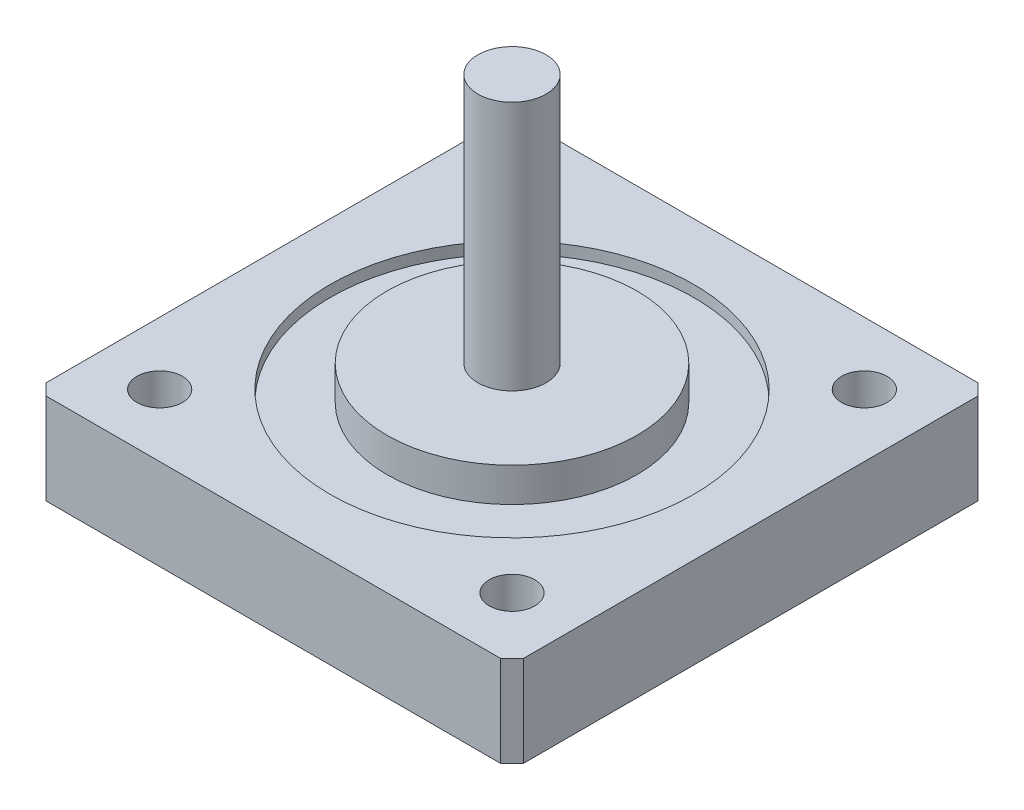
ISO-10303-21;
HEADER;
FILE_DESCRIPTION(('STEP AP214'),'2;1');
FILE_NAME('part.step','',(''),(''),'','','');
FILE_SCHEMA(('AUTOMOTIVE_DESIGN { 1 0 10303 214 1 1 1 1 }'));
ENDSEC;
DATA;
#1=APPLICATION_CONTEXT('core data for automotive mechanical design processes');
#2=APPLICATION_PROTOCOL_DEFINITION('international standard','automotive_design',2000,#1);
#3=PRODUCT_CONTEXT('',#1,'mechanical');
#4=PRODUCT('Part','Part','',(#3));
#5=PRODUCT_RELATED_PRODUCT_CATEGORY('part','',(#4));
#6=PRODUCT_DEFINITION_FORMATION('','',#4);
#7=PRODUCT_DEFINITION_CONTEXT('part definition',#1,'design');
#8=PRODUCT_DEFINITION('design','',#6,#7);
#9=PRODUCT_DEFINITION_SHAPE('','',#8);
#10=(LENGTH_UNIT() NAMED_UNIT(*) SI_UNIT(.MILLI.,.METRE.));
#11=(NAMED_UNIT(*) PLANE_ANGLE_UNIT() SI_UNIT($,.RADIAN.));
#12=(NAMED_UNIT(*) SI_UNIT($,.STERADIAN.) SOLID_ANGLE_UNIT());
#13=UNCERTAINTY_MEASURE_WITH_UNIT(LENGTH_MEASURE(1.E-05),#10,'distance_accuracy_value','');
#14=(GEOMETRIC_REPRESENTATION_CONTEXT(3) GLOBAL_UNCERTAINTY_ASSIGNED_CONTEXT((#13)) GLOBAL_UNIT_ASSIGNED_CONTEXT((#10,
#11,#12)) REPRESENTATION_CONTEXT('',''));
#15=CARTESIAN_POINT('',(0.,0.,0.));
#16=DIRECTION('',(0.,0.,1.));
#17=DIRECTION('',(1.,0.,0.));
#18=AXIS2_PLACEMENT_3D('',#15,#16,#17);
#19=CARTESIAN_POINT('',(-20.,8.,-21.));
#20=DIRECTION('',(0.,0.,1.));
#21=DIRECTION('',(1.,0.,0.));
#22=AXIS2_PLACEMENT_3D('',#19,#20,#21);
#23=PLANE('',#22);
#24=DIRECTION('',(-1.,0.,0.));
#25=VECTOR('',#24,1.);
#26=CARTESIAN_POINT('',(-20.,0.,-21.));
#27=LINE('',#26,#25);
#28=CARTESIAN_POINT('',(20.,0.,-21.));
#29=VERTEX_POINT('',#28);
#30=CARTESIAN_POINT('',(-20.,0.,-21.));
#31=VERTEX_POINT('',#30);
#32=EDGE_CURVE('E131',#29,#31,#27,.T.);
#33=ORIENTED_EDGE('',*,*,#32,.T.);
#34=DIRECTION('',(0.,-1.,0.));
#35=VECTOR('',#34,1.);
#36=CARTESIAN_POINT('',(-20.,8.,-21.));
#37=LINE('',#36,#35);
#38=CARTESIAN_POINT('',(-20.,8.,-21.));
#39=VERTEX_POINT('',#38);
#40=EDGE_CURVE('E11',#39,#31,#37,.T.);
#41=ORIENTED_EDGE('',*,*,#40,.F.);
#42=DIRECTION('',(-1.,0.,0.));
#43=VECTOR('',#42,1.);
#44=CARTESIAN_POINT('',(-20.,8.,-21.));
#45=LINE('',#44,#43);
#46=CARTESIAN_POINT('',(20.,8.,-21.));
#47=VERTEX_POINT('',#46);
#48=EDGE_CURVE('E146',#47,#39,#45,.T.);
#49=ORIENTED_EDGE('',*,*,#48,.F.);
#50=DIRECTION('',(0.,-1.,0.));
#51=VECTOR('',#50,1.);
#52=CARTESIAN_POINT('',(20.,8.,-21.));
#53=LINE('',#52,#51);
#54=EDGE_CURVE('E127',#47,#29,#53,.T.);
#55=ORIENTED_EDGE('',*,*,#54,.T.);
#56=EDGE_LOOP('',(#33,#41,#49,#55));
#57=FACE_BOUND('',#56,.T.);
#58=ADVANCED_FACE('F34',(#57),#23,.F.);
#59=CARTESIAN_POINT('',(-21.,8.,-20.));
#60=DIRECTION('',(0.707106781186549,0.,0.707106781186546));
#61=DIRECTION('',(0.707106781186546,0.,-0.707106781186549));
#62=AXIS2_PLACEMENT_3D('',#59,#60,#61);
#63=PLANE('',#62);
#64=DIRECTION('',(-0.707106781186546,0.,0.707106781186549));
#65=VECTOR('',#64,1.);
#66=CARTESIAN_POINT('',(-21.,0.,-20.));
#67=LINE('',#66,#65);
#68=CARTESIAN_POINT('',(-21.,0.,-20.));
#69=VERTEX_POINT('',#68);
#70=EDGE_CURVE('E134',#31,#69,#67,.T.);
#71=ORIENTED_EDGE('',*,*,#70,.T.);
#72=DIRECTION('',(0.,-1.,0.));
#73=VECTOR('',#72,1.);
#74=CARTESIAN_POINT('',(-21.,8.,-20.));
#75=LINE('',#74,#73);
#76=CARTESIAN_POINT('',(-21.,8.,-20.));
#77=VERTEX_POINT('',#76);
#78=EDGE_CURVE('E43',#77,#69,#75,.T.);
#79=ORIENTED_EDGE('',*,*,#78,.F.);
#80=DIRECTION('',(-0.707106781186546,0.,0.707106781186549));
#81=VECTOR('',#80,1.);
#82=CARTESIAN_POINT('',(-21.,8.,-20.));
#83=LINE('',#82,#81);
#84=EDGE_CURVE('E94',#39,#77,#83,.T.);
#85=ORIENTED_EDGE('',*,*,#84,.F.);
#86=ORIENTED_EDGE('',*,*,#40,.T.);
#87=EDGE_LOOP('',(#71,#79,#85,#86));
#88=FACE_BOUND('',#87,.T.);
#89=ADVANCED_FACE('F238',(#88),#63,.F.);
#90=CARTESIAN_POINT('',(-21.,8.,-20.));
#91=DIRECTION('',(1.,0.,0.));
#92=DIRECTION('',(0.,0.,-1.));
#93=AXIS2_PLACEMENT_3D('',#90,#91,#92);
#94=PLANE('',#93);
#95=DIRECTION('',(0.,0.,1.));
#96=VECTOR('',#95,1.);
#97=CARTESIAN_POINT('',(-21.,0.,-20.));
#98=LINE('',#97,#96);
#99=CARTESIAN_POINT('',(-21.,0.,20.));
#100=VERTEX_POINT('',#99);
#101=EDGE_CURVE('E137',#69,#100,#98,.T.);
#102=ORIENTED_EDGE('',*,*,#101,.T.);
#103=DIRECTION('',(0.,-1.,0.));
#104=VECTOR('',#103,1.);
#105=CARTESIAN_POINT('',(-21.,8.,20.));
#106=LINE('',#105,#104);
#107=CARTESIAN_POINT('',(-21.,8.,20.));
#108=VERTEX_POINT('',#107);
#109=EDGE_CURVE('E153',#108,#100,#106,.T.);
#110=ORIENTED_EDGE('',*,*,#109,.F.);
#111=DIRECTION('',(0.,0.,1.));
#112=VECTOR('',#111,1.);
#113=CARTESIAN_POINT('',(-21.,8.,-20.));
#114=LINE('',#113,#112);
#115=EDGE_CURVE('E162',#77,#108,#114,.T.);
#116=ORIENTED_EDGE('',*,*,#115,.F.);
#117=ORIENTED_EDGE('',*,*,#78,.T.);
#118=EDGE_LOOP('',(#102,#110,#116,#117));
#119=FACE_BOUND('',#118,.T.);
#120=ADVANCED_FACE('F160',(#119),#94,.F.);
#121=CARTESIAN_POINT('',(-21.,8.,20.));
#122=DIRECTION('',(0.707106781186549,0.,-0.707106781186546));
#123=DIRECTION('',(-0.707106781186546,0.,-0.707106781186549));
#124=AXIS2_PLACEMENT_3D('',#121,#122,#123);
#125=PLANE('',#124);
#126=DIRECTION('',(0.707106781186546,0.,0.707106781186549));
#127=VECTOR('',#126,1.);
#128=CARTESIAN_POINT('',(-21.,0.,20.));
#129=LINE('',#128,#127);
#130=CARTESIAN_POINT('',(-20.,0.,21.));
#131=VERTEX_POINT('',#130);
#132=EDGE_CURVE('E139',#100,#131,#129,.T.);
#133=ORIENTED_EDGE('',*,*,#132,.T.);
#134=DIRECTION('',(0.,-1.,0.));
#135=VECTOR('',#134,1.);
#136=CARTESIAN_POINT('',(-20.,8.,21.));
#137=LINE('',#136,#135);
#138=CARTESIAN_POINT('',(-20.,8.,21.));
#139=VERTEX_POINT('',#138);
#140=EDGE_CURVE('E150',#139,#131,#137,.T.);
#141=ORIENTED_EDGE('',*,*,#140,.F.);
#142=DIRECTION('',(0.707106781186546,0.,0.707106781186549));
#143=VECTOR('',#142,1.);
#144=CARTESIAN_POINT('',(-21.,8.,20.));
#145=LINE('',#144,#143);
#146=EDGE_CURVE('E174',#108,#139,#145,.T.);
#147=ORIENTED_EDGE('',*,*,#146,.F.);
#148=ORIENTED_EDGE('',*,*,#109,.T.);
#149=EDGE_LOOP('',(#133,#141,#147,#148));
#150=FACE_BOUND('',#149,.T.);
#151=ADVANCED_FACE('F170',(#150),#125,.F.);
#152=CARTESIAN_POINT('',(-20.,8.,21.));
#153=DIRECTION('',(0.,0.,-1.));
#154=DIRECTION('',(-1.,0.,0.));
#155=AXIS2_PLACEMENT_3D('',#152,#153,#154);
#156=PLANE('',#155);
#157=DIRECTION('',(1.,0.,0.));
#158=VECTOR('',#157,1.);
#159=CARTESIAN_POINT('',(-20.,0.,21.));
#160=LINE('',#159,#158);
#161=CARTESIAN_POINT('',(20.,0.,21.));
#162=VERTEX_POINT('',#161);
#163=EDGE_CURVE('E141',#131,#162,#160,.T.);
#164=ORIENTED_EDGE('',*,*,#163,.T.);
#165=DIRECTION('',(0.,-1.,0.));
#166=VECTOR('',#165,1.);
#167=CARTESIAN_POINT('',(20.,8.,21.));
#168=LINE('',#167,#166);
#169=CARTESIAN_POINT('',(20.,8.,21.));
#170=VERTEX_POINT('',#169);
#171=EDGE_CURVE('E122',#170,#162,#168,.T.);
#172=ORIENTED_EDGE('',*,*,#171,.F.);
#173=DIRECTION('',(1.,0.,0.));
#174=VECTOR('',#173,1.);
#175=CARTESIAN_POINT('',(-20.,8.,21.));
#176=LINE('',#175,#174);
#177=EDGE_CURVE('E113',#139,#170,#176,.T.);
#178=ORIENTED_EDGE('',*,*,#177,.F.);
#179=ORIENTED_EDGE('',*,*,#140,.T.);
#180=EDGE_LOOP('',(#164,#172,#178,#179));
#181=FACE_BOUND('',#180,.T.);
#182=ADVANCED_FACE('F173',(#181),#156,.F.);
#183=CARTESIAN_POINT('',(20.,8.,21.));
#184=DIRECTION('',(-0.707106781186549,0.,-0.707106781186546));
#185=DIRECTION('',(-0.707106781186546,0.,0.707106781186549));
#186=AXIS2_PLACEMENT_3D('',#183,#184,#185);
#187=PLANE('',#186);
#188=DIRECTION('',(0.707106781186546,0.,-0.707106781186549));
#189=VECTOR('',#188,1.);
#190=CARTESIAN_POINT('',(20.,0.,21.));
#191=LINE('',#190,#189);
#192=CARTESIAN_POINT('',(21.,0.,20.));
#193=VERTEX_POINT('',#192);
#194=EDGE_CURVE('E121',#162,#193,#191,.T.);
#195=ORIENTED_EDGE('',*,*,#194,.T.);
#196=DIRECTION('',(0.,-1.,0.));
#197=VECTOR('',#196,1.);
#198=CARTESIAN_POINT('',(21.,8.,20.));
#199=LINE('',#198,#197);
#200=CARTESIAN_POINT('',(21.,8.,20.));
#201=VERTEX_POINT('',#200);
#202=EDGE_CURVE('E118',#201,#193,#199,.T.);
#203=ORIENTED_EDGE('',*,*,#202,.F.);
#204=DIRECTION('',(0.707106781186546,0.,-0.707106781186549));
#205=VECTOR('',#204,1.);
#206=CARTESIAN_POINT('',(20.,8.,21.));
#207=LINE('',#206,#205);
#208=EDGE_CURVE('E107',#170,#201,#207,.T.);
#209=ORIENTED_EDGE('',*,*,#208,.F.);
#210=ORIENTED_EDGE('',*,*,#171,.T.);
#211=EDGE_LOOP('',(#195,#203,#209,#210));
#212=FACE_BOUND('',#211,.T.);
#213=ADVANCED_FACE('F119',(#212),#187,.F.);
#214=CARTESIAN_POINT('',(21.,8.,-20.));
#215=DIRECTION('',(-1.,0.,0.));
#216=DIRECTION('',(0.,0.,1.));
#217=AXIS2_PLACEMENT_3D('',#214,#215,#216);
#218=PLANE('',#217);
#219=DIRECTION('',(0.,0.,-1.));
#220=VECTOR('',#219,1.);
#221=CARTESIAN_POINT('',(21.,0.,-20.));
#222=LINE('',#221,#220);
#223=CARTESIAN_POINT('',(21.,0.,-20.));
#224=VERTEX_POINT('',#223);
#225=EDGE_CURVE('E80',#193,#224,#222,.T.);
#226=ORIENTED_EDGE('',*,*,#225,.T.);
#227=DIRECTION('',(0.,-1.,0.));
#228=VECTOR('',#227,1.);
#229=CARTESIAN_POINT('',(21.,8.,-20.));
#230=LINE('',#229,#228);
#231=CARTESIAN_POINT('',(21.,8.,-20.));
#232=VERTEX_POINT('',#231);
#233=EDGE_CURVE('E123',#232,#224,#230,.T.);
#234=ORIENTED_EDGE('',*,*,#233,.F.);
#235=DIRECTION('',(0.,0.,-1.));
#236=VECTOR('',#235,1.);
#237=CARTESIAN_POINT('',(21.,8.,-20.));
#238=LINE('',#237,#236);
#239=EDGE_CURVE('E111',#201,#232,#238,.T.);
#240=ORIENTED_EDGE('',*,*,#239,.F.);
#241=ORIENTED_EDGE('',*,*,#202,.T.);
#242=EDGE_LOOP('',(#226,#234,#240,#241));
#243=FACE_BOUND('',#242,.T.);
#244=ADVANCED_FACE('F125',(#243),#218,.F.);
#245=CARTESIAN_POINT('',(20.,8.,-21.));
#246=DIRECTION('',(-0.707106781186546,0.,0.707106781186549));
#247=DIRECTION('',(0.707106781186549,0.,0.707106781186546));
#248=AXIS2_PLACEMENT_3D('',#245,#246,#247);
#249=PLANE('',#248);
#250=DIRECTION('',(-0.707106781186549,0.,-0.707106781186546));
#251=VECTOR('',#250,1.);
#252=CARTESIAN_POINT('',(20.,0.,-21.));
#253=LINE('',#252,#251);
#254=EDGE_CURVE('E86',#224,#29,#253,.T.);
#255=ORIENTED_EDGE('',*,*,#254,.T.);
#256=ORIENTED_EDGE('',*,*,#54,.F.);
#257=DIRECTION('',(-0.707106781186549,0.,-0.707106781186546));
#258=VECTOR('',#257,1.);
#259=CARTESIAN_POINT('',(20.,8.,-21.));
#260=LINE('',#259,#258);
#261=EDGE_CURVE('E51',#232,#47,#260,.T.);
#262=ORIENTED_EDGE('',*,*,#261,.F.);
#263=ORIENTED_EDGE('',*,*,#233,.T.);
#264=EDGE_LOOP('',(#255,#256,#262,#263));
#265=FACE_BOUND('',#264,.T.);
#266=ADVANCED_FACE('F245',(#265),#249,.F.);
#267=CARTESIAN_POINT('',(0.,8.,0.));
#268=DIRECTION('',(0.,-1.,0.));
#269=DIRECTION('',(0.,0.,-1.));
#270=AXIS2_PLACEMENT_3D('',#267,#268,#269);
#271=PLANE('',#270);
#272=CARTESIAN_POINT('',(15.5,8.,-15.5));
#273=DIRECTION('',(0.,1.,0.));
#274=DIRECTION('',(0.,0.,1.));
#275=AXIS2_PLACEMENT_3D('',#272,#273,#274);
#276=CIRCLE('',#275,2.00000000000001);
#277=CARTESIAN_POINT('',(15.5,8.,-13.5));
#278=VERTEX_POINT('',#277);
#279=EDGE_CURVE('E207',#278,#278,#276,.T.);
#280=ORIENTED_EDGE('',*,*,#279,.F.);
#281=EDGE_LOOP('',(#280));
#282=FACE_BOUND('',#281,.T.);
#283=CARTESIAN_POINT('',(15.5,8.,15.5));
#284=DIRECTION('',(0.,1.,0.));
#285=DIRECTION('',(0.,0.,1.));
#286=AXIS2_PLACEMENT_3D('',#283,#284,#285);
#287=CIRCLE('',#286,2.);
#288=CARTESIAN_POINT('',(15.5,8.,17.5));
#289=VERTEX_POINT('',#288);
#290=EDGE_CURVE('E201',#289,#289,#287,.T.);
#291=ORIENTED_EDGE('',*,*,#290,.F.);
#292=EDGE_LOOP('',(#291));
#293=FACE_BOUND('',#292,.T.);
#294=CARTESIAN_POINT('',(-15.5,8.,15.5));
#295=DIRECTION('',(0.,1.,0.));
#296=DIRECTION('',(0.,0.,1.));
#297=AXIS2_PLACEMENT_3D('',#294,#295,#296);
#298=CIRCLE('',#297,2.);
#299=CARTESIAN_POINT('',(-15.5,8.,17.5));
#300=VERTEX_POINT('',#299);
#301=EDGE_CURVE('E195',#300,#300,#298,.T.);
#302=ORIENTED_EDGE('',*,*,#301,.F.);
#303=EDGE_LOOP('',(#302));
#304=FACE_BOUND('',#303,.T.);
#305=CARTESIAN_POINT('',(-15.5,8.,-15.5));
#306=DIRECTION('',(0.,1.,0.));
#307=DIRECTION('',(0.,0.,1.));
#308=AXIS2_PLACEMENT_3D('',#305,#306,#307);
#309=CIRCLE('',#308,2.);
#310=CARTESIAN_POINT('',(-15.5,8.,-13.5));
#311=VERTEX_POINT('',#310);
#312=EDGE_CURVE('E189',#311,#311,#309,.T.);
#313=ORIENTED_EDGE('',*,*,#312,.F.);
#314=EDGE_LOOP('',(#313));
#315=FACE_BOUND('',#314,.T.);
#316=CARTESIAN_POINT('',(0.,8.,0.));
#317=DIRECTION('',(0.,1.,0.));
#318=DIRECTION('',(0.,0.,1.));
#319=AXIS2_PLACEMENT_3D('',#316,#317,#318);
#320=CIRCLE('',#319,16.);
#321=CARTESIAN_POINT('',(0.,8.,16.));
#322=VERTEX_POINT('',#321);
#323=EDGE_CURVE('E180',#322,#322,#320,.T.);
#324=ORIENTED_EDGE('',*,*,#323,.F.);
#325=EDGE_LOOP('',(#324));
#326=FACE_BOUND('',#325,.T.);
#327=ORIENTED_EDGE('',*,*,#48,.T.);
#328=ORIENTED_EDGE('',*,*,#84,.T.);
#329=ORIENTED_EDGE('',*,*,#115,.T.);
#330=ORIENTED_EDGE('',*,*,#146,.T.);
#331=ORIENTED_EDGE('',*,*,#177,.T.);
#332=ORIENTED_EDGE('',*,*,#208,.T.);
#333=ORIENTED_EDGE('',*,*,#239,.T.);
#334=ORIENTED_EDGE('',*,*,#261,.T.);
#335=EDGE_LOOP('',(#327,#328,#329,#330,#331,#332,#333,#334));
#336=FACE_BOUND('',#335,.T.);
#337=ADVANCED_FACE('F109',(#282,#293,#304,#315,#326,#336),#271,.F.);
#338=CARTESIAN_POINT('',(0.,0.,0.));
#339=DIRECTION('',(0.,-1.,0.));
#340=DIRECTION('',(0.,0.,-1.));
#341=AXIS2_PLACEMENT_3D('',#338,#339,#340);
#342=PLANE('',#341);
#343=CARTESIAN_POINT('',(15.5,0.,-15.5));
#344=DIRECTION('',(0.,1.,0.));
#345=DIRECTION('',(0.,0.,1.));
#346=AXIS2_PLACEMENT_3D('',#343,#344,#345);
#347=CIRCLE('',#346,2.00000000000001);
#348=CARTESIAN_POINT('',(15.5,0.,-13.5));
#349=VERTEX_POINT('',#348);
#350=EDGE_CURVE('E192',#349,#349,#347,.T.);
#351=ORIENTED_EDGE('',*,*,#350,.T.);
#352=EDGE_LOOP('',(#351));
#353=FACE_BOUND('',#352,.T.);
#354=CARTESIAN_POINT('',(15.5,0.,15.5));
#355=DIRECTION('',(0.,1.,0.));
#356=DIRECTION('',(0.,0.,1.));
#357=AXIS2_PLACEMENT_3D('',#354,#355,#356);
#358=CIRCLE('',#357,2.);
#359=CARTESIAN_POINT('',(15.5,0.,17.5));
#360=VERTEX_POINT('',#359);
#361=EDGE_CURVE('E204',#360,#360,#358,.T.);
#362=ORIENTED_EDGE('',*,*,#361,.T.);
#363=EDGE_LOOP('',(#362));
#364=FACE_BOUND('',#363,.T.);
#365=CARTESIAN_POINT('',(-15.5,0.,15.5));
#366=DIRECTION('',(0.,1.,0.));
#367=DIRECTION('',(0.,0.,1.));
#368=AXIS2_PLACEMENT_3D('',#365,#366,#367);
#369=CIRCLE('',#368,2.);
#370=CARTESIAN_POINT('',(-15.5,0.,17.5));
#371=VERTEX_POINT('',#370);
#372=EDGE_CURVE('E198',#371,#371,#369,.T.);
#373=ORIENTED_EDGE('',*,*,#372,.T.);
#374=EDGE_LOOP('',(#373));
#375=FACE_BOUND('',#374,.T.);
#376=CARTESIAN_POINT('',(-15.5,0.,-15.5));
#377=DIRECTION('',(0.,1.,0.));
#378=DIRECTION('',(0.,0.,1.));
#379=AXIS2_PLACEMENT_3D('',#376,#377,#378);
#380=CIRCLE('',#379,2.);
#381=CARTESIAN_POINT('',(-15.5,0.,-13.5));
#382=VERTEX_POINT('',#381);
#383=EDGE_CURVE('E188',#382,#382,#380,.T.);
#384=ORIENTED_EDGE('',*,*,#383,.T.);
#385=EDGE_LOOP('',(#384));
#386=FACE_BOUND('',#385,.T.);
#387=ORIENTED_EDGE('',*,*,#32,.F.);
#388=ORIENTED_EDGE('',*,*,#254,.F.);
#389=ORIENTED_EDGE('',*,*,#225,.F.);
#390=ORIENTED_EDGE('',*,*,#194,.F.);
#391=ORIENTED_EDGE('',*,*,#163,.F.);
#392=ORIENTED_EDGE('',*,*,#132,.F.);
#393=ORIENTED_EDGE('',*,*,#101,.F.);
#394=ORIENTED_EDGE('',*,*,#70,.F.);
#395=EDGE_LOOP('',(#387,#388,#389,#390,#391,#392,#393,#394));
#396=FACE_BOUND('',#395,.T.);
#397=ADVANCED_FACE('F166',(#353,#364,#375,#386,#396),#342,.T.);
#398=CARTESIAN_POINT('',(0.,7.,0.));
#399=DIRECTION('',(0.,1.,0.));
#400=DIRECTION('',(0.,0.,1.));
#401=AXIS2_PLACEMENT_3D('',#398,#399,#400);
#402=CYLINDRICAL_SURFACE('',#401,16.);
#403=CARTESIAN_POINT('',(0.,7.,0.));
#404=DIRECTION('',(0.,1.,0.));
#405=DIRECTION('',(0.,0.,1.));
#406=AXIS2_PLACEMENT_3D('',#403,#404,#405);
#407=CIRCLE('',#406,16.);
#408=CARTESIAN_POINT('',(0.,7.,16.));
#409=VERTEX_POINT('',#408);
#410=EDGE_CURVE('E135',#409,#409,#407,.T.);
#411=ORIENTED_EDGE('',*,*,#410,.F.);
#412=EDGE_LOOP('',(#411));
#413=FACE_BOUND('',#412,.T.);
#414=ORIENTED_EDGE('',*,*,#323,.T.);
#415=EDGE_LOOP('',(#414));
#416=FACE_BOUND('',#415,.T.);
#417=ADVANCED_FACE('F294',(#413,#416),#402,.F.);
#418=CARTESIAN_POINT('',(0.,7.,0.));
#419=DIRECTION('',(0.,1.,0.));
#420=DIRECTION('',(0.,0.,1.));
#421=AXIS2_PLACEMENT_3D('',#418,#419,#420);
#422=PLANE('',#421);
#423=CARTESIAN_POINT('',(0.,7.,0.));
#424=DIRECTION('',(0.,1.,0.));
#425=DIRECTION('',(0.,0.,1.));
#426=AXIS2_PLACEMENT_3D('',#423,#424,#425);
#427=CIRCLE('',#426,11.);
#428=CARTESIAN_POINT('',(0.,7.,11.));
#429=VERTEX_POINT('',#428);
#430=EDGE_CURVE('E183',#429,#429,#427,.T.);
#431=ORIENTED_EDGE('',*,*,#430,.F.);
#432=EDGE_LOOP('',(#431));
#433=FACE_BOUND('',#432,.T.);
#434=ORIENTED_EDGE('',*,*,#410,.T.);
#435=EDGE_LOOP('',(#434));
#436=FACE_BOUND('',#435,.T.);
#437=ADVANCED_FACE('F299',(#433,#436),#422,.T.);
#438=CARTESIAN_POINT('',(0.,7.,0.));
#439=DIRECTION('',(0.,1.,0.));
#440=DIRECTION('',(0.,0.,1.));
#441=AXIS2_PLACEMENT_3D('',#438,#439,#440);
#442=CYLINDRICAL_SURFACE('',#441,11.);
#443=ORIENTED_EDGE('',*,*,#430,.T.);
#444=EDGE_LOOP('',(#443));
#445=FACE_BOUND('',#444,.T.);
#446=CARTESIAN_POINT('',(0.,10.,0.));
#447=DIRECTION('',(0.,1.,0.));
#448=DIRECTION('',(0.,0.,1.));
#449=AXIS2_PLACEMENT_3D('',#446,#447,#448);
#450=CIRCLE('',#449,11.);
#451=CARTESIAN_POINT('',(0.,10.,11.));
#452=VERTEX_POINT('',#451);
#453=EDGE_CURVE('E212',#452,#452,#450,.T.);
#454=ORIENTED_EDGE('',*,*,#453,.F.);
#455=EDGE_LOOP('',(#454));
#456=FACE_BOUND('',#455,.T.);
#457=ADVANCED_FACE('F311',(#445,#456),#442,.T.);
#458=CARTESIAN_POINT('',(-15.5,0.,-15.5));
#459=DIRECTION('',(0.,1.,0.));
#460=DIRECTION('',(0.,0.,1.));
#461=AXIS2_PLACEMENT_3D('',#458,#459,#460);
#462=CYLINDRICAL_SURFACE('',#461,2.);
#463=ORIENTED_EDGE('',*,*,#383,.F.);
#464=EDGE_LOOP('',(#463));
#465=FACE_BOUND('',#464,.T.);
#466=ORIENTED_EDGE('',*,*,#312,.T.);
#467=EDGE_LOOP('',(#466));
#468=FACE_BOUND('',#467,.T.);
#469=ADVANCED_FACE('F330',(#465,#468),#462,.F.);
#470=CARTESIAN_POINT('',(-15.5,0.,15.5));
#471=DIRECTION('',(0.,1.,0.));
#472=DIRECTION('',(0.,0.,1.));
#473=AXIS2_PLACEMENT_3D('',#470,#471,#472);
#474=CYLINDRICAL_SURFACE('',#473,2.);
#475=ORIENTED_EDGE('',*,*,#372,.F.);
#476=EDGE_LOOP('',(#475));
#477=FACE_BOUND('',#476,.T.);
#478=ORIENTED_EDGE('',*,*,#301,.T.);
#479=EDGE_LOOP('',(#478));
#480=FACE_BOUND('',#479,.T.);
#481=ADVANCED_FACE('F335',(#477,#480),#474,.F.);
#482=CARTESIAN_POINT('',(15.5,0.,15.5));
#483=DIRECTION('',(0.,1.,0.));
#484=DIRECTION('',(0.,0.,1.));
#485=AXIS2_PLACEMENT_3D('',#482,#483,#484);
#486=CYLINDRICAL_SURFACE('',#485,2.);
#487=ORIENTED_EDGE('',*,*,#361,.F.);
#488=EDGE_LOOP('',(#487));
#489=FACE_BOUND('',#488,.T.);
#490=ORIENTED_EDGE('',*,*,#290,.T.);
#491=EDGE_LOOP('',(#490));
#492=FACE_BOUND('',#491,.T.);
#493=ADVANCED_FACE('F345',(#489,#492),#486,.F.);
#494=CARTESIAN_POINT('',(15.5,0.,-15.5));
#495=DIRECTION('',(0.,1.,0.));
#496=DIRECTION('',(0.,0.,1.));
#497=AXIS2_PLACEMENT_3D('',#494,#495,#496);
#498=CYLINDRICAL_SURFACE('',#497,2.00000000000001);
#499=ORIENTED_EDGE('',*,*,#350,.F.);
#500=EDGE_LOOP('',(#499));
#501=FACE_BOUND('',#500,.T.);
#502=ORIENTED_EDGE('',*,*,#279,.T.);
#503=EDGE_LOOP('',(#502));
#504=FACE_BOUND('',#503,.T.);
#505=ADVANCED_FACE('F231',(#501,#504),#498,.F.);
#506=CARTESIAN_POINT('',(0.,10.,0.));
#507=DIRECTION('',(0.,1.,0.));
#508=DIRECTION('',(0.,0.,1.));
#509=AXIS2_PLACEMENT_3D('',#506,#507,#508);
#510=PLANE('',#509);
#511=CARTESIAN_POINT('',(0.,10.,0.));
#512=DIRECTION('',(0.,1.,0.));
#513=DIRECTION('',(0.,0.,1.));
#514=AXIS2_PLACEMENT_3D('',#511,#512,#513);
#515=CIRCLE('',#514,3.);
#516=CARTESIAN_POINT('',(0.,10.,3.));
#517=VERTEX_POINT('',#516);
#518=EDGE_CURVE('E37',#517,#517,#515,.T.);
#519=ORIENTED_EDGE('',*,*,#518,.F.);
#520=EDGE_LOOP('',(#519));
#521=FACE_BOUND('',#520,.T.);
#522=ORIENTED_EDGE('',*,*,#453,.T.);
#523=EDGE_LOOP('',(#522));
#524=FACE_BOUND('',#523,.T.);
#525=ADVANCED_FACE('F223',(#521,#524),#510,.T.);
#526=CARTESIAN_POINT('',(0.,18.,0.));
#527=DIRECTION('',(0.,-1.,0.));
#528=DIRECTION('',(0.,0.,-1.));
#529=AXIS2_PLACEMENT_3D('',#526,#527,#528);
#530=CYLINDRICAL_SURFACE('',#529,3.);
#531=ORIENTED_EDGE('',*,*,#518,.T.);
#532=EDGE_LOOP('',(#531));
#533=FACE_BOUND('',#532,.T.);
#534=CARTESIAN_POINT('',(0.,32.,0.));
#535=DIRECTION('',(0.,1.,0.));
#536=DIRECTION('',(0.,0.,1.));
#537=AXIS2_PLACEMENT_3D('',#534,#535,#536);
#538=CIRCLE('',#537,3.);
#539=CARTESIAN_POINT('',(0.,32.,3.));
#540=VERTEX_POINT('',#539);
#541=EDGE_CURVE('E215',#540,#540,#538,.T.);
#542=ORIENTED_EDGE('',*,*,#541,.F.);
#543=EDGE_LOOP('',(#542));
#544=FACE_BOUND('',#543,.T.);
#545=ADVANCED_FACE('F221',(#533,#544),#530,.T.);
#546=CARTESIAN_POINT('',(0.,32.,0.));
#547=DIRECTION('',(0.,1.,0.));
#548=DIRECTION('',(0.,0.,1.));
#549=AXIS2_PLACEMENT_3D('',#546,#547,#548);
#550=PLANE('',#549);
#551=ORIENTED_EDGE('',*,*,#541,.T.);
#552=EDGE_LOOP('',(#551));
#553=FACE_BOUND('',#552,.T.);
#554=ADVANCED_FACE('F219',(#553),#550,.T.);
#555=CLOSED_SHELL('',(#58,#89,#120,#151,#182,#213,#244,#266,#337,#397,#417,#437,#457,#469,#481,
#493,#505,#525,#545,#554));
#556=MANIFOLD_SOLID_BREP('B2',#555);
#557=ADVANCED_BREP_SHAPE_REPRESENTATION('',(#18,#556),#14);
#558=SHAPE_DEFINITION_REPRESENTATION(#9,#557);
ENDSEC;
END-ISO-10303-21;
